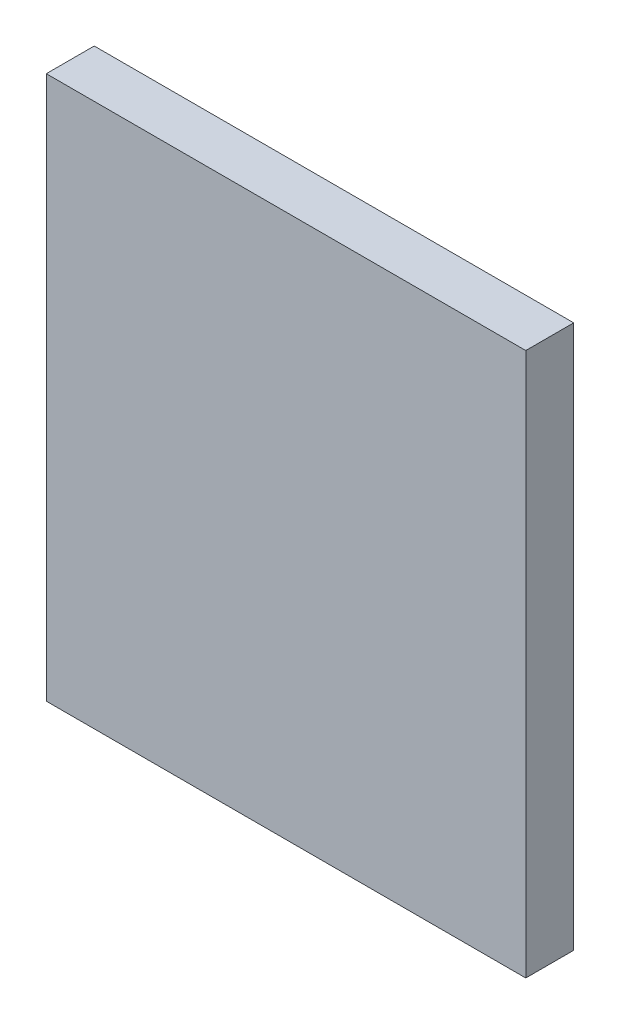
ISO-10303-21;
HEADER;
FILE_DESCRIPTION(('STEP AP214'),'2;1');
FILE_NAME('part.step','',(''),(''),'','','');
FILE_SCHEMA(('AUTOMOTIVE_DESIGN { 1 0 10303 214 1 1 1 1 }'));
ENDSEC;
DATA;
#1=APPLICATION_CONTEXT('core data for automotive mechanical design processes');
#2=APPLICATION_PROTOCOL_DEFINITION('international standard','automotive_design',2000,#1);
#3=PRODUCT_CONTEXT('',#1,'mechanical');
#4=PRODUCT('Part','Part','',(#3));
#5=PRODUCT_RELATED_PRODUCT_CATEGORY('part','',(#4));
#6=PRODUCT_DEFINITION_FORMATION('','',#4);
#7=PRODUCT_DEFINITION_CONTEXT('part definition',#1,'design');
#8=PRODUCT_DEFINITION('design','',#6,#7);
#9=PRODUCT_DEFINITION_SHAPE('','',#8);
#10=(LENGTH_UNIT() NAMED_UNIT(*) SI_UNIT(.MILLI.,.METRE.));
#11=(NAMED_UNIT(*) PLANE_ANGLE_UNIT() SI_UNIT($,.RADIAN.));
#12=(NAMED_UNIT(*) SI_UNIT($,.STERADIAN.) SOLID_ANGLE_UNIT());
#13=UNCERTAINTY_MEASURE_WITH_UNIT(LENGTH_MEASURE(1.E-05),#10,'distance_accuracy_value','');
#14=(GEOMETRIC_REPRESENTATION_CONTEXT(3) GLOBAL_UNCERTAINTY_ASSIGNED_CONTEXT((#13)) GLOBAL_UNIT_ASSIGNED_CONTEXT((#10,
#11,#12)) REPRESENTATION_CONTEXT('',''));
#15=CARTESIAN_POINT('',(0.,0.,0.));
#16=DIRECTION('',(0.,0.,1.));
#17=DIRECTION('',(1.,0.,0.));
#18=AXIS2_PLACEMENT_3D('',#15,#16,#17);
#19=CARTESIAN_POINT('',(30.,-34.,6.));
#20=DIRECTION('',(-1.,0.,0.));
#21=DIRECTION('',(0.,0.,1.));
#22=AXIS2_PLACEMENT_3D('',#19,#20,#21);
#23=PLANE('',#22);
#24=DIRECTION('',(0.,1.,0.));
#25=VECTOR('',#24,1.);
#26=CARTESIAN_POINT('',(30.,-34.,0.));
#27=LINE('',#26,#25);
#28=CARTESIAN_POINT('',(30.,-34.,0.));
#29=VERTEX_POINT('',#28);
#30=CARTESIAN_POINT('',(30.,34.,0.));
#31=VERTEX_POINT('',#30);
#32=EDGE_CURVE('E96',#29,#31,#27,.T.);
#33=ORIENTED_EDGE('',*,*,#32,.T.);
#34=DIRECTION('',(0.,0.,-1.));
#35=VECTOR('',#34,1.);
#36=CARTESIAN_POINT('',(30.,34.,6.));
#37=LINE('',#36,#35);
#38=CARTESIAN_POINT('',(30.,34.,6.));
#39=VERTEX_POINT('',#38);
#40=EDGE_CURVE('E11',#39,#31,#37,.T.);
#41=ORIENTED_EDGE('',*,*,#40,.F.);
#42=DIRECTION('',(0.,1.,0.));
#43=VECTOR('',#42,1.);
#44=CARTESIAN_POINT('',(30.,-34.,6.));
#45=LINE('',#44,#43);
#46=CARTESIAN_POINT('',(30.,-34.,6.));
#47=VERTEX_POINT('',#46);
#48=EDGE_CURVE('E84',#47,#39,#45,.T.);
#49=ORIENTED_EDGE('',*,*,#48,.F.);
#50=DIRECTION('',(0.,0.,-1.));
#51=VECTOR('',#50,1.);
#52=CARTESIAN_POINT('',(30.,-34.,6.));
#53=LINE('',#52,#51);
#54=EDGE_CURVE('E92',#47,#29,#53,.T.);
#55=ORIENTED_EDGE('',*,*,#54,.T.);
#56=EDGE_LOOP('',(#33,#41,#49,#55));
#57=FACE_BOUND('',#56,.T.);
#58=ADVANCED_FACE('F33',(#57),#23,.F.);
#59=CARTESIAN_POINT('',(-30.,34.,6.));
#60=DIRECTION('',(0.,-1.,0.));
#61=DIRECTION('',(0.,0.,-1.));
#62=AXIS2_PLACEMENT_3D('',#59,#60,#61);
#63=PLANE('',#62);
#64=DIRECTION('',(-1.,0.,0.));
#65=VECTOR('',#64,1.);
#66=CARTESIAN_POINT('',(-30.,34.,0.));
#67=LINE('',#66,#65);
#68=CARTESIAN_POINT('',(-30.,34.,0.));
#69=VERTEX_POINT('',#68);
#70=EDGE_CURVE('E88',#31,#69,#67,.T.);
#71=ORIENTED_EDGE('',*,*,#70,.T.);
#72=DIRECTION('',(0.,0.,-1.));
#73=VECTOR('',#72,1.);
#74=CARTESIAN_POINT('',(-30.,34.,6.));
#75=LINE('',#74,#73);
#76=CARTESIAN_POINT('',(-30.,34.,6.));
#77=VERTEX_POINT('',#76);
#78=EDGE_CURVE('E41',#77,#69,#75,.T.);
#79=ORIENTED_EDGE('',*,*,#78,.F.);
#80=DIRECTION('',(-1.,0.,0.));
#81=VECTOR('',#80,1.);
#82=CARTESIAN_POINT('',(-30.,34.,6.));
#83=LINE('',#82,#81);
#84=EDGE_CURVE('E79',#39,#77,#83,.T.);
#85=ORIENTED_EDGE('',*,*,#84,.F.);
#86=ORIENTED_EDGE('',*,*,#40,.T.);
#87=EDGE_LOOP('',(#71,#79,#85,#86));
#88=FACE_BOUND('',#87,.T.);
#89=ADVANCED_FACE('F87',(#88),#63,.F.);
#90=CARTESIAN_POINT('',(-30.,-34.,6.));
#91=DIRECTION('',(1.,0.,0.));
#92=DIRECTION('',(0.,0.,-1.));
#93=AXIS2_PLACEMENT_3D('',#90,#91,#92);
#94=PLANE('',#93);
#95=DIRECTION('',(0.,-1.,0.));
#96=VECTOR('',#95,1.);
#97=CARTESIAN_POINT('',(-30.,-34.,0.));
#98=LINE('',#97,#96);
#99=CARTESIAN_POINT('',(-30.,-34.,0.));
#100=VERTEX_POINT('',#99);
#101=EDGE_CURVE('E66',#69,#100,#98,.T.);
#102=ORIENTED_EDGE('',*,*,#101,.T.);
#103=DIRECTION('',(0.,0.,-1.));
#104=VECTOR('',#103,1.);
#105=CARTESIAN_POINT('',(-30.,-34.,6.));
#106=LINE('',#105,#104);
#107=CARTESIAN_POINT('',(-30.,-34.,6.));
#108=VERTEX_POINT('',#107);
#109=EDGE_CURVE('E89',#108,#100,#106,.T.);
#110=ORIENTED_EDGE('',*,*,#109,.F.);
#111=DIRECTION('',(0.,-1.,0.));
#112=VECTOR('',#111,1.);
#113=CARTESIAN_POINT('',(-30.,-34.,6.));
#114=LINE('',#113,#112);
#115=EDGE_CURVE('E82',#77,#108,#114,.T.);
#116=ORIENTED_EDGE('',*,*,#115,.F.);
#117=ORIENTED_EDGE('',*,*,#78,.T.);
#118=EDGE_LOOP('',(#102,#110,#116,#117));
#119=FACE_BOUND('',#118,.T.);
#120=ADVANCED_FACE('F90',(#119),#94,.F.);
#121=CARTESIAN_POINT('',(-30.,-34.,6.));
#122=DIRECTION('',(0.,1.,0.));
#123=DIRECTION('',(0.,0.,1.));
#124=AXIS2_PLACEMENT_3D('',#121,#122,#123);
#125=PLANE('',#124);
#126=DIRECTION('',(1.,0.,0.));
#127=VECTOR('',#126,1.);
#128=CARTESIAN_POINT('',(-30.,-34.,0.));
#129=LINE('',#128,#127);
#130=EDGE_CURVE('E72',#100,#29,#129,.T.);
#131=ORIENTED_EDGE('',*,*,#130,.T.);
#132=ORIENTED_EDGE('',*,*,#54,.F.);
#133=DIRECTION('',(1.,0.,0.));
#134=VECTOR('',#133,1.);
#135=CARTESIAN_POINT('',(-30.,-34.,6.));
#136=LINE('',#135,#134);
#137=EDGE_CURVE('E49',#108,#47,#136,.T.);
#138=ORIENTED_EDGE('',*,*,#137,.F.);
#139=ORIENTED_EDGE('',*,*,#109,.T.);
#140=EDGE_LOOP('',(#131,#132,#138,#139));
#141=FACE_BOUND('',#140,.T.);
#142=ADVANCED_FACE('F103',(#141),#125,.F.);
#143=CARTESIAN_POINT('',(0.,0.,6.));
#144=DIRECTION('',(0.,0.,-1.));
#145=DIRECTION('',(-1.,0.,0.));
#146=AXIS2_PLACEMENT_3D('',#143,#144,#145);
#147=PLANE('',#146);
#148=ORIENTED_EDGE('',*,*,#48,.T.);
#149=ORIENTED_EDGE('',*,*,#84,.T.);
#150=ORIENTED_EDGE('',*,*,#115,.T.);
#151=ORIENTED_EDGE('',*,*,#137,.T.);
#152=EDGE_LOOP('',(#148,#149,#150,#151));
#153=FACE_BOUND('',#152,.T.);
#154=ADVANCED_FACE('F80',(#153),#147,.F.);
#155=CARTESIAN_POINT('',(0.,0.,0.));
#156=DIRECTION('',(0.,0.,-1.));
#157=DIRECTION('',(-1.,0.,0.));
#158=AXIS2_PLACEMENT_3D('',#155,#156,#157);
#159=PLANE('',#158);
#160=ORIENTED_EDGE('',*,*,#32,.F.);
#161=ORIENTED_EDGE('',*,*,#130,.F.);
#162=ORIENTED_EDGE('',*,*,#101,.F.);
#163=ORIENTED_EDGE('',*,*,#70,.F.);
#164=EDGE_LOOP('',(#160,#161,#162,#163));
#165=FACE_BOUND('',#164,.T.);
#166=ADVANCED_FACE('F106',(#165),#159,.T.);
#167=CLOSED_SHELL('',(#58,#89,#120,#142,#154,#166));
#168=MANIFOLD_SOLID_BREP('B2',#167);
#169=ADVANCED_BREP_SHAPE_REPRESENTATION('',(#18,#168),#14);
#170=SHAPE_DEFINITION_REPRESENTATION(#9,#169);
ENDSEC;
END-ISO-10303-21;
